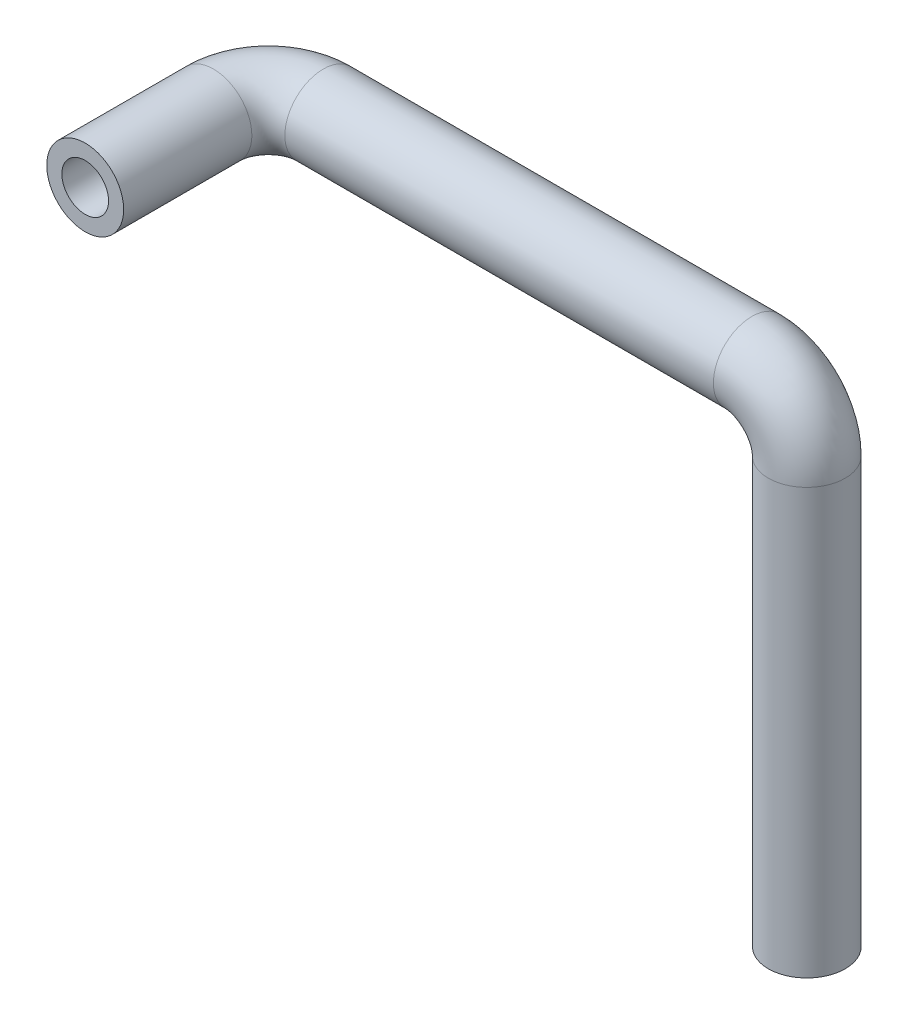
ISO-10303-21;
HEADER;
FILE_DESCRIPTION(('STEP AP214'),'2;1');
FILE_NAME('part.step','',(''),(''),'','','');
FILE_SCHEMA(('AUTOMOTIVE_DESIGN { 1 0 10303 214 1 1 1 1 }'));
ENDSEC;
DATA;
#1=APPLICATION_CONTEXT('core data for automotive mechanical design processes');
#2=APPLICATION_PROTOCOL_DEFINITION('international standard','automotive_design',2000,#1);
#3=PRODUCT_CONTEXT('',#1,'mechanical');
#4=PRODUCT('Part','Part','',(#3));
#5=PRODUCT_RELATED_PRODUCT_CATEGORY('part','',(#4));
#6=PRODUCT_DEFINITION_FORMATION('','',#4);
#7=PRODUCT_DEFINITION_CONTEXT('part definition',#1,'design');
#8=PRODUCT_DEFINITION('design','',#6,#7);
#9=PRODUCT_DEFINITION_SHAPE('','',#8);
#10=(LENGTH_UNIT() NAMED_UNIT(*) SI_UNIT(.MILLI.,.METRE.));
#11=(NAMED_UNIT(*) PLANE_ANGLE_UNIT() SI_UNIT($,.RADIAN.));
#12=(NAMED_UNIT(*) SI_UNIT($,.STERADIAN.) SOLID_ANGLE_UNIT());
#13=UNCERTAINTY_MEASURE_WITH_UNIT(LENGTH_MEASURE(1.E-05),#10,'distance_accuracy_value','');
#14=(GEOMETRIC_REPRESENTATION_CONTEXT(3) GLOBAL_UNCERTAINTY_ASSIGNED_CONTEXT((#13)) GLOBAL_UNIT_ASSIGNED_CONTEXT((#10,
#11,#12)) REPRESENTATION_CONTEXT('',''));
#15=CARTESIAN_POINT('',(0.,0.,0.));
#16=DIRECTION('',(0.,0.,1.));
#17=DIRECTION('',(1.,0.,0.));
#18=AXIS2_PLACEMENT_3D('',#15,#16,#17);
#19=CARTESIAN_POINT('',(0.,0.,0.));
#20=DIRECTION('',(0.,1.,0.));
#21=DIRECTION('',(0.,0.,1.));
#22=AXIS2_PLACEMENT_3D('',#19,#20,#21);
#23=CYLINDRICAL_SURFACE('',#22,10.5);
#24=CARTESIAN_POINT('',(0.,116.,0.));
#25=DIRECTION('',(0.,1.,0.));
#26=DIRECTION('',(0.,0.,1.));
#27=AXIS2_PLACEMENT_3D('',#24,#25,#26);
#28=CIRCLE('',#27,10.5);
#29=CARTESIAN_POINT('',(10.5,116.,0.));
#30=VERTEX_POINT('',#29);
#31=EDGE_CURVE('E80',#30,#30,#28,.T.);
#32=ORIENTED_EDGE('',*,*,#31,.F.);
#33=EDGE_LOOP('',(#32));
#34=FACE_BOUND('',#33,.T.);
#35=CARTESIAN_POINT('',(0.,0.,0.));
#36=DIRECTION('',(0.,1.,0.));
#37=DIRECTION('',(0.,0.,1.));
#38=AXIS2_PLACEMENT_3D('',#35,#36,#37);
#39=CIRCLE('',#38,10.5);
#40=CARTESIAN_POINT('',(0.,0.,10.5));
#41=VERTEX_POINT('',#40);
#42=EDGE_CURVE('E47',#41,#41,#39,.T.);
#43=ORIENTED_EDGE('',*,*,#42,.T.);
#44=EDGE_LOOP('',(#43));
#45=FACE_BOUND('',#44,.T.);
#46=ADVANCED_FACE('F32',(#34,#45),#23,.T.);
#47=CARTESIAN_POINT('',(-15.,116.,0.));
#48=DIRECTION('',(0.,0.,1.));
#49=DIRECTION('',(1.,0.,0.));
#50=AXIS2_PLACEMENT_3D('',#47,#48,#49);
#51=TOROIDAL_SURFACE('',#50,15.,10.5);
#52=CARTESIAN_POINT('',(-15.,131.,0.));
#53=DIRECTION('',(-1.,0.,0.));
#54=DIRECTION('',(0.,0.,1.));
#55=AXIS2_PLACEMENT_3D('',#52,#53,#54);
#56=CIRCLE('',#55,10.5);
#57=CARTESIAN_POINT('',(-15.,141.5,0.));
#58=VERTEX_POINT('',#57);
#59=EDGE_CURVE('E83',#58,#58,#56,.T.);
#60=CARTESIAN_POINT('',(-15.,116.,0.));
#61=DIRECTION('',(0.,0.,1.));
#62=DIRECTION('',(1.,0.,0.));
#63=AXIS2_PLACEMENT_3D('',#60,#61,#62);
#64=CIRCLE('',#63,25.5);
#65=EDGE_CURVE('',#30,#58,#64,.T.);
#66=ORIENTED_EDGE('',*,*,#31,.T.);
#67=ORIENTED_EDGE('',*,*,#59,.F.);
#68=ORIENTED_EDGE('',*,*,#65,.T.);
#69=ORIENTED_EDGE('',*,*,#65,.F.);
#70=EDGE_LOOP('',(#66,#68,#67,#69));
#71=FACE_BOUND('',#70,.T.);
#72=ADVANCED_FACE('F101',(#71),#51,.T.);
#73=CARTESIAN_POINT('',(-15.,131.,0.));
#74=DIRECTION('',(-1.,0.,0.));
#75=DIRECTION('',(0.,0.,1.));
#76=AXIS2_PLACEMENT_3D('',#73,#74,#75);
#77=CYLINDRICAL_SURFACE('',#76,10.5);
#78=CARTESIAN_POINT('',(-132.,131.,0.));
#79=DIRECTION('',(-1.,0.,0.));
#80=DIRECTION('',(0.,0.,1.));
#81=AXIS2_PLACEMENT_3D('',#78,#79,#80);
#82=CIRCLE('',#81,10.5);
#83=CARTESIAN_POINT('',(-132.,131.,-10.5));
#84=VERTEX_POINT('',#83);
#85=EDGE_CURVE('E85',#84,#84,#82,.T.);
#86=ORIENTED_EDGE('',*,*,#85,.F.);
#87=EDGE_LOOP('',(#86));
#88=FACE_BOUND('',#87,.T.);
#89=ORIENTED_EDGE('',*,*,#59,.T.);
#90=EDGE_LOOP('',(#89));
#91=FACE_BOUND('',#90,.T.);
#92=ADVANCED_FACE('F95',(#88,#91),#77,.T.);
#93=CARTESIAN_POINT('',(-132.,131.,15.));
#94=DIRECTION('',(0.,1.,0.));
#95=DIRECTION('',(0.,0.,1.));
#96=AXIS2_PLACEMENT_3D('',#93,#94,#95);
#97=TOROIDAL_SURFACE('',#96,15.,10.5);
#98=CARTESIAN_POINT('',(-147.,131.,15.));
#99=DIRECTION('',(0.,0.,1.));
#100=DIRECTION('',(1.,0.,0.));
#101=AXIS2_PLACEMENT_3D('',#98,#99,#100);
#102=CIRCLE('',#101,10.5);
#103=CARTESIAN_POINT('',(-157.5,131.,15.));
#104=VERTEX_POINT('',#103);
#105=EDGE_CURVE('E36',#104,#104,#102,.T.);
#106=CARTESIAN_POINT('',(-132.,131.,15.));
#107=DIRECTION('',(0.,1.,0.));
#108=DIRECTION('',(0.,0.,1.));
#109=AXIS2_PLACEMENT_3D('',#106,#107,#108);
#110=CIRCLE('',#109,25.5);
#111=EDGE_CURVE('',#84,#104,#110,.T.);
#112=ORIENTED_EDGE('',*,*,#85,.T.);
#113=ORIENTED_EDGE('',*,*,#105,.F.);
#114=ORIENTED_EDGE('',*,*,#111,.T.);
#115=ORIENTED_EDGE('',*,*,#111,.F.);
#116=EDGE_LOOP('',(#112,#114,#113,#115));
#117=FACE_BOUND('',#116,.T.);
#118=ADVANCED_FACE('F93',(#117),#97,.T.);
#119=CARTESIAN_POINT('',(-147.,131.,15.));
#120=DIRECTION('',(0.,0.,1.));
#121=DIRECTION('',(1.,0.,0.));
#122=AXIS2_PLACEMENT_3D('',#119,#120,#121);
#123=CYLINDRICAL_SURFACE('',#122,10.5);
#124=CARTESIAN_POINT('',(-147.,131.,50.));
#125=DIRECTION('',(0.,0.,1.));
#126=DIRECTION('',(1.,0.,0.));
#127=AXIS2_PLACEMENT_3D('',#124,#125,#126);
#128=CIRCLE('',#127,10.5);
#129=CARTESIAN_POINT('',(-136.5,131.,50.));
#130=VERTEX_POINT('',#129);
#131=EDGE_CURVE('E52',#130,#130,#128,.T.);
#132=ORIENTED_EDGE('',*,*,#131,.F.);
#133=EDGE_LOOP('',(#132));
#134=FACE_BOUND('',#133,.T.);
#135=ORIENTED_EDGE('',*,*,#105,.T.);
#136=EDGE_LOOP('',(#135));
#137=FACE_BOUND('',#136,.T.);
#138=ADVANCED_FACE('F34',(#134,#137),#123,.T.);
#139=CARTESIAN_POINT('',(0.,0.,0.));
#140=DIRECTION('',(0.,1.,0.));
#141=DIRECTION('',(0.,0.,1.));
#142=AXIS2_PLACEMENT_3D('',#139,#140,#141);
#143=PLANE('',#142);
#144=CARTESIAN_POINT('',(0.,0.,0.));
#145=DIRECTION('',(0.,1.,0.));
#146=DIRECTION('',(0.,0.,1.));
#147=AXIS2_PLACEMENT_3D('',#144,#145,#146);
#148=CIRCLE('',#147,6.375);
#149=CARTESIAN_POINT('',(0.,0.,6.375));
#150=VERTEX_POINT('',#149);
#151=EDGE_CURVE('E78',#150,#150,#148,.F.);
#152=ORIENTED_EDGE('',*,*,#151,.F.);
#153=EDGE_LOOP('',(#152));
#154=FACE_BOUND('',#153,.T.);
#155=ORIENTED_EDGE('',*,*,#42,.F.);
#156=EDGE_LOOP('',(#155));
#157=FACE_BOUND('',#156,.T.);
#158=ADVANCED_FACE('F100',(#154,#157),#143,.F.);
#159=CARTESIAN_POINT('',(-147.,131.,50.));
#160=DIRECTION('',(0.,0.,1.));
#161=DIRECTION('',(1.,0.,0.));
#162=AXIS2_PLACEMENT_3D('',#159,#160,#161);
#163=PLANE('',#162);
#164=CARTESIAN_POINT('',(-147.,131.,50.));
#165=DIRECTION('',(0.,0.,1.));
#166=DIRECTION('',(1.,0.,0.));
#167=AXIS2_PLACEMENT_3D('',#164,#165,#166);
#168=CIRCLE('',#167,6.375);
#169=CARTESIAN_POINT('',(-140.625,131.,50.));
#170=VERTEX_POINT('',#169);
#171=EDGE_CURVE('E11',#170,#170,#168,.F.);
#172=ORIENTED_EDGE('',*,*,#171,.T.);
#173=EDGE_LOOP('',(#172));
#174=FACE_BOUND('',#173,.T.);
#175=ORIENTED_EDGE('',*,*,#131,.T.);
#176=EDGE_LOOP('',(#175));
#177=FACE_BOUND('',#176,.T.);
#178=ADVANCED_FACE('F59',(#174,#177),#163,.T.);
#179=CARTESIAN_POINT('',(0.,0.,0.));
#180=DIRECTION('',(0.,1.,0.));
#181=DIRECTION('',(0.,0.,1.));
#182=AXIS2_PLACEMENT_3D('',#179,#180,#181);
#183=CYLINDRICAL_SURFACE('',#182,6.375);
#184=CARTESIAN_POINT('',(0.,116.,0.));
#185=DIRECTION('',(0.,1.,0.));
#186=DIRECTION('',(0.,0.,1.));
#187=AXIS2_PLACEMENT_3D('',#184,#185,#186);
#188=CIRCLE('',#187,6.375);
#189=CARTESIAN_POINT('',(6.375,116.,0.));
#190=VERTEX_POINT('',#189);
#191=EDGE_CURVE('E134',#190,#190,#188,.F.);
#192=ORIENTED_EDGE('',*,*,#191,.F.);
#193=EDGE_LOOP('',(#192));
#194=FACE_BOUND('',#193,.T.);
#195=ORIENTED_EDGE('',*,*,#151,.T.);
#196=EDGE_LOOP('',(#195));
#197=FACE_BOUND('',#196,.T.);
#198=ADVANCED_FACE('F115',(#194,#197),#183,.F.);
#199=CARTESIAN_POINT('',(-15.,116.,0.));
#200=DIRECTION('',(0.,0.,1.));
#201=DIRECTION('',(1.,0.,0.));
#202=AXIS2_PLACEMENT_3D('',#199,#200,#201);
#203=TOROIDAL_SURFACE('',#202,15.,6.375);
#204=CARTESIAN_POINT('',(-15.,131.,0.));
#205=DIRECTION('',(-1.,0.,0.));
#206=DIRECTION('',(0.,0.,1.));
#207=AXIS2_PLACEMENT_3D('',#204,#205,#206);
#208=CIRCLE('',#207,6.375);
#209=CARTESIAN_POINT('',(-15.,137.375,0.));
#210=VERTEX_POINT('',#209);
#211=EDGE_CURVE('E73',#210,#210,#208,.F.);
#212=CARTESIAN_POINT('',(-15.,116.,0.));
#213=DIRECTION('',(0.,0.,1.));
#214=DIRECTION('',(1.,0.,0.));
#215=AXIS2_PLACEMENT_3D('',#212,#213,#214);
#216=CIRCLE('',#215,21.375);
#217=EDGE_CURVE('',#190,#210,#216,.T.);
#218=ORIENTED_EDGE('',*,*,#191,.T.);
#219=ORIENTED_EDGE('',*,*,#211,.F.);
#220=ORIENTED_EDGE('',*,*,#217,.T.);
#221=ORIENTED_EDGE('',*,*,#217,.F.);
#222=EDGE_LOOP('',(#218,#220,#219,#221));
#223=FACE_BOUND('',#222,.T.);
#224=ADVANCED_FACE('F122',(#223),#203,.F.);
#225=CARTESIAN_POINT('',(-15.,131.,0.));
#226=DIRECTION('',(-1.,0.,0.));
#227=DIRECTION('',(0.,0.,1.));
#228=AXIS2_PLACEMENT_3D('',#225,#226,#227);
#229=CYLINDRICAL_SURFACE('',#228,6.375);
#230=CARTESIAN_POINT('',(-132.,131.,0.));
#231=DIRECTION('',(-1.,0.,0.));
#232=DIRECTION('',(0.,0.,1.));
#233=AXIS2_PLACEMENT_3D('',#230,#231,#232);
#234=CIRCLE('',#233,6.375);
#235=CARTESIAN_POINT('',(-132.,131.,-6.37499999999999));
#236=VERTEX_POINT('',#235);
#237=EDGE_CURVE('E70',#236,#236,#234,.F.);
#238=ORIENTED_EDGE('',*,*,#237,.F.);
#239=EDGE_LOOP('',(#238));
#240=FACE_BOUND('',#239,.T.);
#241=ORIENTED_EDGE('',*,*,#211,.T.);
#242=EDGE_LOOP('',(#241));
#243=FACE_BOUND('',#242,.T.);
#244=ADVANCED_FACE('F119',(#240,#243),#229,.F.);
#245=CARTESIAN_POINT('',(-132.,131.,15.));
#246=DIRECTION('',(0.,1.,0.));
#247=DIRECTION('',(0.,0.,1.));
#248=AXIS2_PLACEMENT_3D('',#245,#246,#247);
#249=TOROIDAL_SURFACE('',#248,15.,6.375);
#250=CARTESIAN_POINT('',(-147.,131.,15.));
#251=DIRECTION('',(0.,0.,1.));
#252=DIRECTION('',(1.,0.,0.));
#253=AXIS2_PLACEMENT_3D('',#250,#251,#252);
#254=CIRCLE('',#253,6.375);
#255=CARTESIAN_POINT('',(-153.375,131.,15.));
#256=VERTEX_POINT('',#255);
#257=EDGE_CURVE('E41',#256,#256,#254,.F.);
#258=CARTESIAN_POINT('',(-132.,131.,15.));
#259=DIRECTION('',(0.,1.,0.));
#260=DIRECTION('',(0.,0.,1.));
#261=AXIS2_PLACEMENT_3D('',#258,#259,#260);
#262=CIRCLE('',#261,21.375);
#263=EDGE_CURVE('',#236,#256,#262,.T.);
#264=ORIENTED_EDGE('',*,*,#237,.T.);
#265=ORIENTED_EDGE('',*,*,#257,.F.);
#266=ORIENTED_EDGE('',*,*,#263,.T.);
#267=ORIENTED_EDGE('',*,*,#263,.F.);
#268=EDGE_LOOP('',(#264,#266,#265,#267));
#269=FACE_BOUND('',#268,.T.);
#270=ADVANCED_FACE('F65',(#269),#249,.F.);
#271=CARTESIAN_POINT('',(-147.,131.,15.));
#272=DIRECTION('',(0.,0.,1.));
#273=DIRECTION('',(1.,0.,0.));
#274=AXIS2_PLACEMENT_3D('',#271,#272,#273);
#275=CYLINDRICAL_SURFACE('',#274,6.375);
#276=ORIENTED_EDGE('',*,*,#171,.F.);
#277=EDGE_LOOP('',(#276));
#278=FACE_BOUND('',#277,.T.);
#279=ORIENTED_EDGE('',*,*,#257,.T.);
#280=EDGE_LOOP('',(#279));
#281=FACE_BOUND('',#280,.T.);
#282=ADVANCED_FACE('F62',(#278,#281),#275,.F.);
#283=CLOSED_SHELL('',(#46,#72,#92,#118,#138,#158,#178,#198,#224,#244,#270,#282));
#284=MANIFOLD_SOLID_BREP('B2',#283);
#285=ADVANCED_BREP_SHAPE_REPRESENTATION('',(#18,#284),#14);
#286=SHAPE_DEFINITION_REPRESENTATION(#9,#285);
ENDSEC;
END-ISO-10303-21;
